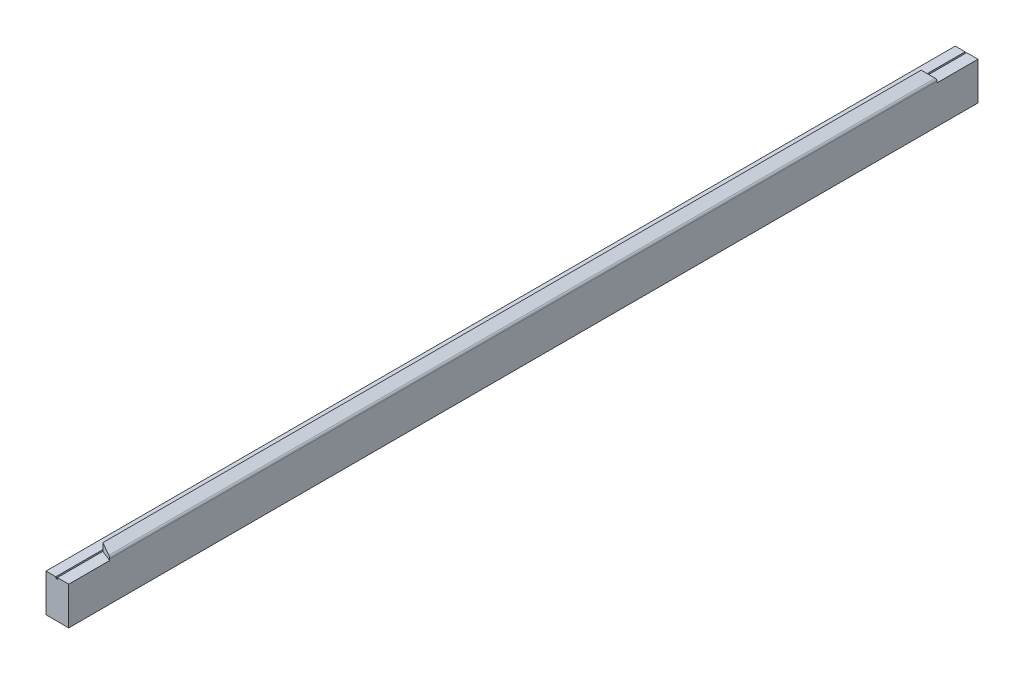
ISO-10303-21;
HEADER;
FILE_DESCRIPTION(('STEP AP214'),'2;1');
FILE_NAME('part.step','',(''),(''),'','','');
FILE_SCHEMA(('AUTOMOTIVE_DESIGN { 1 0 10303 214 1 1 1 1 }'));
ENDSEC;
DATA;
#1=APPLICATION_CONTEXT('core data for automotive mechanical design processes');
#2=APPLICATION_PROTOCOL_DEFINITION('international standard','automotive_design',2000,#1);
#3=PRODUCT_CONTEXT('',#1,'mechanical');
#4=PRODUCT('Part','Part','',(#3));
#5=PRODUCT_RELATED_PRODUCT_CATEGORY('part','',(#4));
#6=PRODUCT_DEFINITION_FORMATION('','',#4);
#7=PRODUCT_DEFINITION_CONTEXT('part definition',#1,'design');
#8=PRODUCT_DEFINITION('design','',#6,#7);
#9=PRODUCT_DEFINITION_SHAPE('','',#8);
#10=(LENGTH_UNIT() NAMED_UNIT(*) SI_UNIT(.MILLI.,.METRE.));
#11=(NAMED_UNIT(*) PLANE_ANGLE_UNIT() SI_UNIT($,.RADIAN.));
#12=(NAMED_UNIT(*) SI_UNIT($,.STERADIAN.) SOLID_ANGLE_UNIT());
#13=UNCERTAINTY_MEASURE_WITH_UNIT(LENGTH_MEASURE(1.E-05),#10,'distance_accuracy_value','');
#14=(GEOMETRIC_REPRESENTATION_CONTEXT(3) GLOBAL_UNCERTAINTY_ASSIGNED_CONTEXT((#13)) GLOBAL_UNIT_ASSIGNED_CONTEXT((#10,
#11,#12)) REPRESENTATION_CONTEXT('',''));
#15=CARTESIAN_POINT('',(0.,0.,0.));
#16=DIRECTION('',(0.,0.,1.));
#17=DIRECTION('',(1.,0.,0.));
#18=AXIS2_PLACEMENT_3D('',#15,#16,#17);
#19=CARTESIAN_POINT('',(0.,50.,0.));
#20=DIRECTION('',(0.,-1.,0.));
#21=DIRECTION('',(0.,0.,-1.));
#22=AXIS2_PLACEMENT_3D('',#19,#20,#21);
#23=PLANE('',#22);
#24=DIRECTION('',(-1.,0.,0.));
#25=VECTOR('',#24,1.);
#26=CARTESIAN_POINT('',(0.,50.,1200.));
#27=LINE('',#26,#25);
#28=CARTESIAN_POINT('',(13.,50.,1200.));
#29=VERTEX_POINT('',#28);
#30=CARTESIAN_POINT('',(0.,50.,1200.));
#31=VERTEX_POINT('',#30);
#32=EDGE_CURVE('E202',#29,#31,#27,.T.);
#33=ORIENTED_EDGE('',*,*,#32,.F.);
#34=DIRECTION('',(0.,0.,1.));
#35=VECTOR('',#34,1.);
#36=CARTESIAN_POINT('',(13.,50.,1200.));
#37=LINE('',#36,#35);
#38=CARTESIAN_POINT('',(13.,50.,0.));
#39=VERTEX_POINT('',#38);
#40=EDGE_CURVE('E134',#39,#29,#37,.T.);
#41=ORIENTED_EDGE('',*,*,#40,.F.);
#42=DIRECTION('',(1.,0.,0.));
#43=VECTOR('',#42,1.);
#44=CARTESIAN_POINT('',(0.,50.,0.));
#45=LINE('',#44,#43);
#46=CARTESIAN_POINT('',(0.,50.,0.));
#47=VERTEX_POINT('',#46);
#48=EDGE_CURVE('E192',#47,#39,#45,.T.);
#49=ORIENTED_EDGE('',*,*,#48,.F.);
#50=DIRECTION('',(0.,0.,1.));
#51=VECTOR('',#50,1.);
#52=CARTESIAN_POINT('',(0.,50.,0.));
#53=LINE('',#52,#51);
#54=EDGE_CURVE('E195',#47,#31,#53,.T.);
#55=ORIENTED_EDGE('',*,*,#54,.T.);
#56=EDGE_LOOP('',(#33,#41,#49,#55));
#57=FACE_BOUND('',#56,.T.);
#58=ADVANCED_FACE('F33',(#57),#23,.F.);
#59=CARTESIAN_POINT('',(15.,50.,0.));
#60=VERTEX_POINT('',#59);
#61=CARTESIAN_POINT('',(30.,50.,0.));
#62=VERTEX_POINT('',#61);
#63=EDGE_CURVE('E56',#60,#62,#45,.T.);
#64=ORIENTED_EDGE('',*,*,#63,.F.);
#65=DIRECTION('',(0.,0.,1.));
#66=VECTOR('',#65,1.);
#67=CARTESIAN_POINT('',(15.,50.,0.));
#68=LINE('',#67,#66);
#69=CARTESIAN_POINT('',(15.,50.,60.0000000000001));
#70=VERTEX_POINT('',#69);
#71=EDGE_CURVE('E11',#60,#70,#68,.T.);
#72=ORIENTED_EDGE('',*,*,#71,.T.);
#73=DIRECTION('',(0.928476690885259,0.,-0.371390676354104));
#74=VECTOR('',#73,1.);
#75=CARTESIAN_POINT('',(30.,50.,54.));
#76=LINE('',#75,#74);
#77=CARTESIAN_POINT('',(30.,50.,54.));
#78=VERTEX_POINT('',#77);
#79=EDGE_CURVE('E160',#70,#78,#76,.T.);
#80=ORIENTED_EDGE('',*,*,#79,.T.);
#81=DIRECTION('',(0.,0.,-1.));
#82=VECTOR('',#81,1.);
#83=CARTESIAN_POINT('',(30.,50.,0.));
#84=LINE('',#83,#82);
#85=EDGE_CURVE('E166',#78,#62,#84,.T.);
#86=ORIENTED_EDGE('',*,*,#85,.T.);
#87=EDGE_LOOP('',(#64,#72,#80,#86));
#88=FACE_BOUND('',#87,.T.);
#89=ADVANCED_FACE('F269',(#88),#23,.F.);
#90=CARTESIAN_POINT('',(30.,0.,1200.));
#91=DIRECTION('',(-1.,0.,0.));
#92=DIRECTION('',(0.,0.,1.));
#93=AXIS2_PLACEMENT_3D('',#90,#91,#92);
#94=PLANE('',#93);
#95=DIRECTION('',(0.,-1.,0.));
#96=VECTOR('',#95,1.);
#97=CARTESIAN_POINT('',(30.,60.,54.));
#98=LINE('',#97,#96);
#99=CARTESIAN_POINT('',(30.,51.9689011157193,54.));
#100=VERTEX_POINT('',#99);
#101=EDGE_CURVE('E168',#100,#78,#98,.T.);
#102=ORIENTED_EDGE('',*,*,#101,.F.);
#103=DIRECTION('',(0.,0.,1.));
#104=VECTOR('',#103,1.);
#105=CARTESIAN_POINT('',(30.,51.9689011157193,1200.));
#106=LINE('',#105,#104);
#107=CARTESIAN_POINT('',(30.,51.9689011157193,1146.));
#108=VERTEX_POINT('',#107);
#109=EDGE_CURVE('E222',#100,#108,#106,.T.);
#110=ORIENTED_EDGE('',*,*,#109,.T.);
#111=DIRECTION('',(0.,-1.,0.));
#112=VECTOR('',#111,1.);
#113=CARTESIAN_POINT('',(30.,60.,1146.));
#114=LINE('',#113,#112);
#115=CARTESIAN_POINT('',(30.,50.,1146.));
#116=VERTEX_POINT('',#115);
#117=EDGE_CURVE('E186',#108,#116,#114,.T.);
#118=ORIENTED_EDGE('',*,*,#117,.T.);
#119=DIRECTION('',(0.,0.,-1.));
#120=VECTOR('',#119,1.);
#121=CARTESIAN_POINT('',(30.,50.,1200.));
#122=LINE('',#121,#120);
#123=CARTESIAN_POINT('',(30.,50.,1200.));
#124=VERTEX_POINT('',#123);
#125=EDGE_CURVE('E178',#124,#116,#122,.T.);
#126=ORIENTED_EDGE('',*,*,#125,.F.);
#127=DIRECTION('',(0.,1.,0.));
#128=VECTOR('',#127,1.);
#129=CARTESIAN_POINT('',(30.,0.,1200.));
#130=LINE('',#129,#128);
#131=CARTESIAN_POINT('',(30.,0.,1200.));
#132=VERTEX_POINT('',#131);
#133=EDGE_CURVE('E208',#132,#124,#130,.T.);
#134=ORIENTED_EDGE('',*,*,#133,.F.);
#135=DIRECTION('',(0.,0.,-1.));
#136=VECTOR('',#135,1.);
#137=CARTESIAN_POINT('',(30.,0.,1200.));
#138=LINE('',#137,#136);
#139=CARTESIAN_POINT('',(30.,0.,0.));
#140=VERTEX_POINT('',#139);
#141=EDGE_CURVE('E211',#132,#140,#138,.T.);
#142=ORIENTED_EDGE('',*,*,#141,.T.);
#143=DIRECTION('',(0.,1.,0.));
#144=VECTOR('',#143,1.);
#145=CARTESIAN_POINT('',(30.,0.,0.));
#146=LINE('',#145,#144);
#147=EDGE_CURVE('E206',#140,#62,#146,.T.);
#148=ORIENTED_EDGE('',*,*,#147,.T.);
#149=ORIENTED_EDGE('',*,*,#85,.F.);
#150=EDGE_LOOP('',(#102,#110,#118,#126,#134,#142,#148,#149));
#151=FACE_BOUND('',#150,.T.);
#152=ADVANCED_FACE('F238',(#151),#94,.F.);
#153=CARTESIAN_POINT('',(15.,60.,0.));
#154=DIRECTION('',(1.,0.,0.));
#155=DIRECTION('',(0.,1.,0.));
#156=AXIS2_PLACEMENT_3D('',#153,#154,#155);
#157=PLANE('',#156);
#158=DIRECTION('',(0.,-1.,0.));
#159=VECTOR('',#158,1.);
#160=CARTESIAN_POINT('',(15.,60.,60.0000000000001));
#161=LINE('',#160,#159);
#162=CARTESIAN_POINT('',(15.,60.,60.0000000000001));
#163=VERTEX_POINT('',#162);
#164=EDGE_CURVE('E170',#163,#70,#161,.T.);
#165=ORIENTED_EDGE('',*,*,#164,.T.);
#166=ORIENTED_EDGE('',*,*,#71,.F.);
#167=DIRECTION('',(0.,1.,0.));
#168=VECTOR('',#167,1.);
#169=CARTESIAN_POINT('',(15.,48.,0.));
#170=LINE('',#169,#168);
#171=CARTESIAN_POINT('',(15.,48.,0.));
#172=VERTEX_POINT('',#171);
#173=EDGE_CURVE('E161',#172,#60,#170,.T.);
#174=ORIENTED_EDGE('',*,*,#173,.F.);
#175=DIRECTION('',(0.,0.,-1.));
#176=VECTOR('',#175,1.);
#177=CARTESIAN_POINT('',(15.,48.,1200.));
#178=LINE('',#177,#176);
#179=CARTESIAN_POINT('',(15.,48.,1200.));
#180=VERTEX_POINT('',#179);
#181=EDGE_CURVE('E151',#180,#172,#178,.T.);
#182=ORIENTED_EDGE('',*,*,#181,.F.);
#183=DIRECTION('',(0.,1.,0.));
#184=VECTOR('',#183,1.);
#185=CARTESIAN_POINT('',(15.,48.,1200.));
#186=LINE('',#185,#184);
#187=CARTESIAN_POINT('',(15.,50.,1200.));
#188=VERTEX_POINT('',#187);
#189=EDGE_CURVE('E48',#180,#188,#186,.T.);
#190=ORIENTED_EDGE('',*,*,#189,.T.);
#191=DIRECTION('',(0.,0.,-1.));
#192=VECTOR('',#191,1.);
#193=CARTESIAN_POINT('',(15.,50.,1200.));
#194=LINE('',#193,#192);
#195=CARTESIAN_POINT('',(15.,50.,1140.));
#196=VERTEX_POINT('',#195);
#197=EDGE_CURVE('E147',#188,#196,#194,.T.);
#198=ORIENTED_EDGE('',*,*,#197,.T.);
#199=DIRECTION('',(0.,-1.,0.));
#200=VECTOR('',#199,1.);
#201=CARTESIAN_POINT('',(15.,60.,1140.));
#202=LINE('',#201,#200);
#203=CARTESIAN_POINT('',(15.,60.,1140.));
#204=VERTEX_POINT('',#203);
#205=EDGE_CURVE('E183',#204,#196,#202,.T.);
#206=ORIENTED_EDGE('',*,*,#205,.F.);
#207=DIRECTION('',(0.,0.,1.));
#208=VECTOR('',#207,1.);
#209=CARTESIAN_POINT('',(15.,60.,0.));
#210=LINE('',#209,#208);
#211=EDGE_CURVE('E198',#163,#204,#210,.T.);
#212=ORIENTED_EDGE('',*,*,#211,.F.);
#213=EDGE_LOOP('',(#165,#166,#174,#182,#190,#198,#206,#212));
#214=FACE_BOUND('',#213,.T.);
#215=ADVANCED_FACE('F251',(#214),#157,.F.);
#216=CARTESIAN_POINT('',(15.,60.,0.));
#217=DIRECTION('',(-0.371390676354104,-0.928476690885259,0.));
#218=DIRECTION('',(0.92847669088526,-0.371390676354104,0.));
#219=AXIS2_PLACEMENT_3D('',#216,#217,#218);
#220=PLANE('',#219);
#221=DIRECTION('',(0.870388279778489,-0.348155311911396,-0.348155311911396));
#222=VECTOR('',#221,1.);
#223=CARTESIAN_POINT('',(33.1818181818182,52.7272727272727,52.7272727272728));
#224=LINE('',#223,#222);
#225=CARTESIAN_POINT('',(28.1141720290623,54.7543311883751,54.7543311883752));
#226=VERTEX_POINT('',#225);
#227=EDGE_CURVE('E176',#163,#226,#224,.T.);
#228=ORIENTED_EDGE('',*,*,#227,.F.);
#229=ORIENTED_EDGE('',*,*,#211,.T.);
#230=DIRECTION('',(-0.870388279778493,0.348155311911397,-0.348155311911385));
#231=VECTOR('',#230,1.);
#232=CARTESIAN_POINT('',(-330.454545454536,198.181818181814,1001.81818181819));
#233=LINE('',#232,#231);
#234=CARTESIAN_POINT('',(28.1141720290623,54.7543311883751,1145.24566881162));
#235=VERTEX_POINT('',#234);
#236=EDGE_CURVE('E189',#235,#204,#233,.T.);
#237=ORIENTED_EDGE('',*,*,#236,.F.);
#238=DIRECTION('',(0.,0.,1.));
#239=VECTOR('',#238,1.);
#240=CARTESIAN_POINT('',(28.1141720290623,54.7543311883751,0.));
#241=LINE('',#240,#239);
#242=EDGE_CURVE('E228',#235,#226,#241,.F.);
#243=ORIENTED_EDGE('',*,*,#242,.T.);
#244=EDGE_LOOP('',(#228,#229,#237,#243));
#245=FACE_BOUND('',#244,.T.);
#246=ADVANCED_FACE('F249',(#245),#220,.F.);
#247=CARTESIAN_POINT('',(27.,51.9689011157193,1200.));
#248=DIRECTION('',(0.,0.,1.));
#249=DIRECTION('',(1.,0.,0.));
#250=AXIS2_PLACEMENT_3D('',#247,#248,#249);
#251=CYLINDRICAL_SURFACE('',#250,3.);
#252=ORIENTED_EDGE('',*,*,#109,.F.);
#253=CARTESIAN_POINT('',(27.,51.9689011157193,55.2000000000001));
#254=DIRECTION('',(-0.371390676354104,0.,-0.928476690885259));
#255=DIRECTION('',(-0.928476690885259,0.,0.371390676354104));
#256=AXIS2_PLACEMENT_3D('',#253,#254,#255);
#257=ELLIPSE('',#256,3.2310988842807,3.);
#258=EDGE_CURVE('E173',#100,#226,#257,.F.);
#259=ORIENTED_EDGE('',*,*,#258,.T.);
#260=ORIENTED_EDGE('',*,*,#242,.F.);
#261=CARTESIAN_POINT('',(27.,51.9689011157193,1144.8));
#262=DIRECTION('',(-0.371390676354092,0.,0.928476690885264));
#263=DIRECTION('',(0.928476690885264,0.,0.371390676354092));
#264=AXIS2_PLACEMENT_3D('',#261,#262,#263);
#265=ELLIPSE('',#264,3.23109888428069,3.);
#266=EDGE_CURVE('E41',#235,#108,#265,.F.);
#267=ORIENTED_EDGE('',*,*,#266,.T.);
#268=EDGE_LOOP('',(#252,#259,#260,#267));
#269=FACE_BOUND('',#268,.T.);
#270=ADVANCED_FACE('F35',(#269),#251,.T.);
#271=CARTESIAN_POINT('',(0.,0.,1200.));
#272=DIRECTION('',(0.,0.,-1.));
#273=DIRECTION('',(-1.,0.,0.));
#274=AXIS2_PLACEMENT_3D('',#271,#272,#273);
#275=PLANE('',#274);
#276=DIRECTION('',(1.,0.,0.));
#277=VECTOR('',#276,1.);
#278=CARTESIAN_POINT('',(13.,48.,1200.));
#279=LINE('',#278,#277);
#280=CARTESIAN_POINT('',(13.,48.,1200.));
#281=VERTEX_POINT('',#280);
#282=EDGE_CURVE('E144',#281,#180,#279,.T.);
#283=ORIENTED_EDGE('',*,*,#282,.F.);
#284=DIRECTION('',(0.,1.,0.));
#285=VECTOR('',#284,1.);
#286=CARTESIAN_POINT('',(13.,48.,1200.));
#287=LINE('',#286,#285);
#288=EDGE_CURVE('E128',#281,#29,#287,.T.);
#289=ORIENTED_EDGE('',*,*,#288,.T.);
#290=ORIENTED_EDGE('',*,*,#32,.T.);
#291=DIRECTION('',(0.,-1.,0.));
#292=VECTOR('',#291,1.);
#293=CARTESIAN_POINT('',(0.,0.,1200.));
#294=LINE('',#293,#292);
#295=CARTESIAN_POINT('',(0.,0.,1200.));
#296=VERTEX_POINT('',#295);
#297=EDGE_CURVE('E203',#31,#296,#294,.T.);
#298=ORIENTED_EDGE('',*,*,#297,.T.);
#299=DIRECTION('',(1.,0.,0.));
#300=VECTOR('',#299,1.);
#301=CARTESIAN_POINT('',(0.,0.,1200.));
#302=LINE('',#301,#300);
#303=EDGE_CURVE('E205',#296,#132,#302,.T.);
#304=ORIENTED_EDGE('',*,*,#303,.T.);
#305=ORIENTED_EDGE('',*,*,#133,.T.);
#306=EDGE_CURVE('E199',#124,#188,#27,.T.);
#307=ORIENTED_EDGE('',*,*,#306,.T.);
#308=ORIENTED_EDGE('',*,*,#189,.F.);
#309=EDGE_LOOP('',(#283,#289,#290,#298,#304,#305,#307,#308));
#310=FACE_BOUND('',#309,.T.);
#311=ADVANCED_FACE('F149',(#310),#275,.F.);
#312=CARTESIAN_POINT('',(0.,0.,1200.));
#313=DIRECTION('',(1.,0.,0.));
#314=DIRECTION('',(0.,0.,-1.));
#315=AXIS2_PLACEMENT_3D('',#312,#313,#314);
#316=PLANE('',#315);
#317=ORIENTED_EDGE('',*,*,#297,.F.);
#318=ORIENTED_EDGE('',*,*,#54,.F.);
#319=DIRECTION('',(0.,-1.,0.));
#320=VECTOR('',#319,1.);
#321=CARTESIAN_POINT('',(0.,0.,0.));
#322=LINE('',#321,#320);
#323=CARTESIAN_POINT('',(0.,0.,0.));
#324=VERTEX_POINT('',#323);
#325=EDGE_CURVE('E201',#47,#324,#322,.T.);
#326=ORIENTED_EDGE('',*,*,#325,.T.);
#327=DIRECTION('',(0.,0.,-1.));
#328=VECTOR('',#327,1.);
#329=CARTESIAN_POINT('',(0.,0.,1200.));
#330=LINE('',#329,#328);
#331=EDGE_CURVE('E219',#296,#324,#330,.T.);
#332=ORIENTED_EDGE('',*,*,#331,.F.);
#333=EDGE_LOOP('',(#317,#318,#326,#332));
#334=FACE_BOUND('',#333,.T.);
#335=ADVANCED_FACE('F265',(#334),#316,.F.);
#336=CARTESIAN_POINT('',(0.,0.,1200.));
#337=DIRECTION('',(0.,1.,0.));
#338=DIRECTION('',(0.,0.,1.));
#339=AXIS2_PLACEMENT_3D('',#336,#337,#338);
#340=PLANE('',#339);
#341=DIRECTION('',(1.,0.,0.));
#342=VECTOR('',#341,1.);
#343=CARTESIAN_POINT('',(0.,0.,0.));
#344=LINE('',#343,#342);
#345=EDGE_CURVE('E213',#324,#140,#344,.T.);
#346=ORIENTED_EDGE('',*,*,#345,.T.);
#347=ORIENTED_EDGE('',*,*,#141,.F.);
#348=ORIENTED_EDGE('',*,*,#303,.F.);
#349=ORIENTED_EDGE('',*,*,#331,.T.);
#350=EDGE_LOOP('',(#346,#347,#348,#349));
#351=FACE_BOUND('',#350,.T.);
#352=ADVANCED_FACE('F260',(#351),#340,.F.);
#353=CARTESIAN_POINT('',(0.,0.,0.));
#354=DIRECTION('',(0.,0.,-1.));
#355=DIRECTION('',(-1.,0.,0.));
#356=AXIS2_PLACEMENT_3D('',#353,#354,#355);
#357=PLANE('',#356);
#358=DIRECTION('',(0.,1.,0.));
#359=VECTOR('',#358,1.);
#360=CARTESIAN_POINT('',(13.,48.,0.));
#361=LINE('',#360,#359);
#362=CARTESIAN_POINT('',(13.,48.,0.));
#363=VERTEX_POINT('',#362);
#364=EDGE_CURVE('E158',#363,#39,#361,.T.);
#365=ORIENTED_EDGE('',*,*,#364,.F.);
#366=DIRECTION('',(-1.,0.,0.));
#367=VECTOR('',#366,1.);
#368=CARTESIAN_POINT('',(13.,48.,0.));
#369=LINE('',#368,#367);
#370=EDGE_CURVE('E138',#172,#363,#369,.T.);
#371=ORIENTED_EDGE('',*,*,#370,.F.);
#372=ORIENTED_EDGE('',*,*,#173,.T.);
#373=ORIENTED_EDGE('',*,*,#63,.T.);
#374=ORIENTED_EDGE('',*,*,#147,.F.);
#375=ORIENTED_EDGE('',*,*,#345,.F.);
#376=ORIENTED_EDGE('',*,*,#325,.F.);
#377=ORIENTED_EDGE('',*,*,#48,.T.);
#378=EDGE_LOOP('',(#365,#371,#372,#373,#374,#375,#376,#377));
#379=FACE_BOUND('',#378,.T.);
#380=ADVANCED_FACE('F262',(#379),#357,.T.);
#381=DIRECTION('',(-0.928476690885264,0.,-0.371390676354092));
#382=VECTOR('',#381,1.);
#383=CARTESIAN_POINT('',(30.,50.,1146.));
#384=LINE('',#383,#382);
#385=EDGE_CURVE('E180',#116,#196,#384,.T.);
#386=ORIENTED_EDGE('',*,*,#385,.T.);
#387=ORIENTED_EDGE('',*,*,#197,.F.);
#388=ORIENTED_EDGE('',*,*,#306,.F.);
#389=ORIENTED_EDGE('',*,*,#125,.T.);
#390=EDGE_LOOP('',(#386,#387,#388,#389));
#391=FACE_BOUND('',#390,.T.);
#392=ADVANCED_FACE('F253',(#391),#23,.F.);
#393=CARTESIAN_POINT('',(30.,60.,1146.));
#394=DIRECTION('',(-0.371390676354092,0.,0.928476690885264));
#395=DIRECTION('',(0.928476690885264,0.,0.371390676354092));
#396=AXIS2_PLACEMENT_3D('',#393,#394,#395);
#397=PLANE('',#396);
#398=ORIENTED_EDGE('',*,*,#236,.T.);
#399=ORIENTED_EDGE('',*,*,#205,.T.);
#400=ORIENTED_EDGE('',*,*,#385,.F.);
#401=ORIENTED_EDGE('',*,*,#117,.F.);
#402=ORIENTED_EDGE('',*,*,#266,.F.);
#403=EDGE_LOOP('',(#398,#399,#400,#401,#402));
#404=FACE_BOUND('',#403,.T.);
#405=ADVANCED_FACE('F244',(#404),#397,.T.);
#406=CARTESIAN_POINT('',(30.,60.,54.));
#407=DIRECTION('',(-0.371390676354104,0.,-0.928476690885259));
#408=DIRECTION('',(-0.928476690885259,0.,0.371390676354104));
#409=AXIS2_PLACEMENT_3D('',#406,#407,#408);
#410=PLANE('',#409);
#411=ORIENTED_EDGE('',*,*,#227,.T.);
#412=ORIENTED_EDGE('',*,*,#258,.F.);
#413=ORIENTED_EDGE('',*,*,#101,.T.);
#414=ORIENTED_EDGE('',*,*,#79,.F.);
#415=ORIENTED_EDGE('',*,*,#164,.F.);
#416=EDGE_LOOP('',(#411,#412,#413,#414,#415));
#417=FACE_BOUND('',#416,.T.);
#418=ADVANCED_FACE('F246',(#417),#410,.T.);
#419=CARTESIAN_POINT('',(13.,48.,1200.));
#420=DIRECTION('',(-1.,0.,0.));
#421=DIRECTION('',(0.,0.,1.));
#422=AXIS2_PLACEMENT_3D('',#419,#420,#421);
#423=PLANE('',#422);
#424=ORIENTED_EDGE('',*,*,#40,.T.);
#425=ORIENTED_EDGE('',*,*,#288,.F.);
#426=DIRECTION('',(0.,0.,1.));
#427=VECTOR('',#426,1.);
#428=CARTESIAN_POINT('',(13.,48.,1200.));
#429=LINE('',#428,#427);
#430=EDGE_CURVE('E131',#363,#281,#429,.T.);
#431=ORIENTED_EDGE('',*,*,#430,.F.);
#432=ORIENTED_EDGE('',*,*,#364,.T.);
#433=EDGE_LOOP('',(#424,#425,#431,#432));
#434=FACE_BOUND('',#433,.T.);
#435=ADVANCED_FACE('F130',(#434),#423,.F.);
#436=CARTESIAN_POINT('',(0.,48.,0.));
#437=DIRECTION('',(0.,-1.,0.));
#438=DIRECTION('',(0.,0.,-1.));
#439=AXIS2_PLACEMENT_3D('',#436,#437,#438);
#440=PLANE('',#439);
#441=ORIENTED_EDGE('',*,*,#430,.T.);
#442=ORIENTED_EDGE('',*,*,#282,.T.);
#443=ORIENTED_EDGE('',*,*,#181,.T.);
#444=ORIENTED_EDGE('',*,*,#370,.T.);
#445=EDGE_LOOP('',(#441,#442,#443,#444));
#446=FACE_BOUND('',#445,.T.);
#447=ADVANCED_FACE('F142',(#446),#440,.F.);
#448=CLOSED_SHELL('',(#58,#89,#152,#215,#246,#270,#311,#335,#352,#380,#392,#405,#418,#435,#447));
#449=MANIFOLD_SOLID_BREP('B2',#448);
#450=ADVANCED_BREP_SHAPE_REPRESENTATION('',(#18,#449),#14);
#451=SHAPE_DEFINITION_REPRESENTATION(#9,#450);
ENDSEC;
END-ISO-10303-21;
